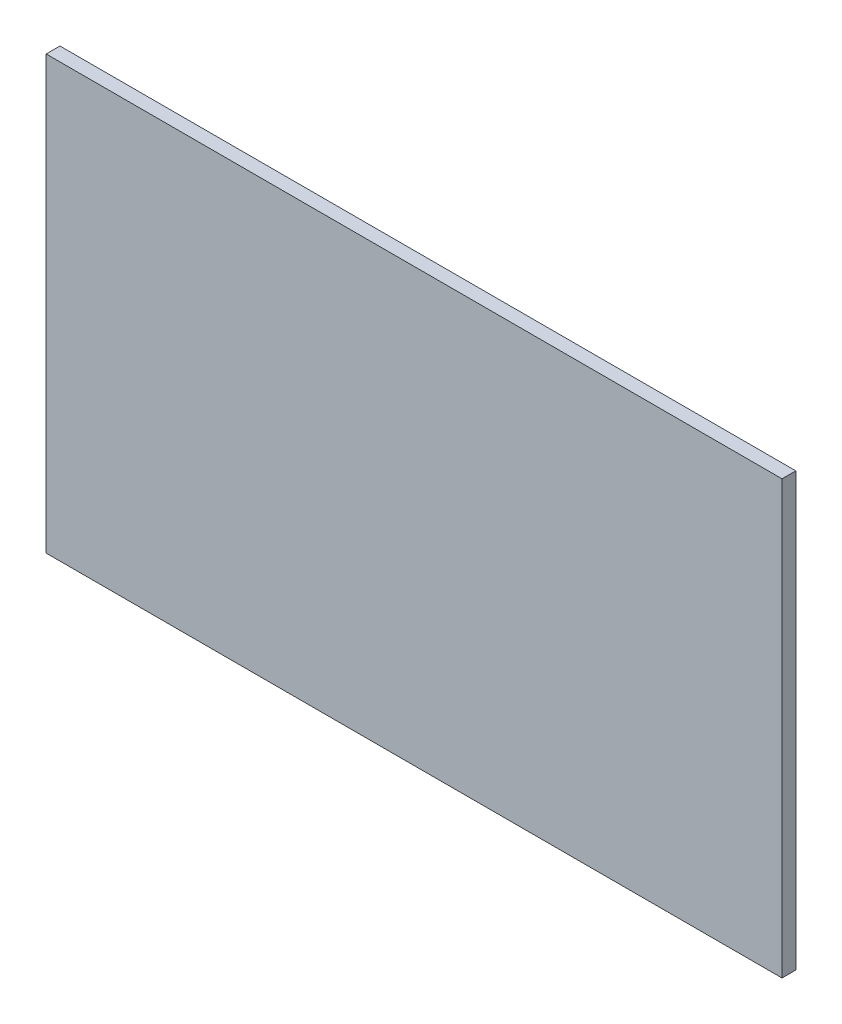
ISO-10303-21;
HEADER;
FILE_DESCRIPTION(('STEP AP214'),'2;1');
FILE_NAME('part.step','',(''),(''),'','','');
FILE_SCHEMA(('AUTOMOTIVE_DESIGN { 1 0 10303 214 1 1 1 1 }'));
ENDSEC;
DATA;
#1=APPLICATION_CONTEXT('core data for automotive mechanical design processes');
#2=APPLICATION_PROTOCOL_DEFINITION('international standard','automotive_design',2000,#1);
#3=PRODUCT_CONTEXT('',#1,'mechanical');
#4=PRODUCT('Part','Part','',(#3));
#5=PRODUCT_RELATED_PRODUCT_CATEGORY('part','',(#4));
#6=PRODUCT_DEFINITION_FORMATION('','',#4);
#7=PRODUCT_DEFINITION_CONTEXT('part definition',#1,'design');
#8=PRODUCT_DEFINITION('design','',#6,#7);
#9=PRODUCT_DEFINITION_SHAPE('','',#8);
#10=(LENGTH_UNIT() NAMED_UNIT(*) SI_UNIT(.MILLI.,.METRE.));
#11=(NAMED_UNIT(*) PLANE_ANGLE_UNIT() SI_UNIT($,.RADIAN.));
#12=(NAMED_UNIT(*) SI_UNIT($,.STERADIAN.) SOLID_ANGLE_UNIT());
#13=UNCERTAINTY_MEASURE_WITH_UNIT(LENGTH_MEASURE(1.E-05),#10,'distance_accuracy_value','');
#14=(GEOMETRIC_REPRESENTATION_CONTEXT(3) GLOBAL_UNCERTAINTY_ASSIGNED_CONTEXT((#13)) GLOBAL_UNIT_ASSIGNED_CONTEXT((#10,
#11,#12)) REPRESENTATION_CONTEXT('',''));
#15=CARTESIAN_POINT('',(0.,0.,0.));
#16=DIRECTION('',(0.,0.,1.));
#17=DIRECTION('',(1.,0.,0.));
#18=AXIS2_PLACEMENT_3D('',#15,#16,#17);
#19=CARTESIAN_POINT('',(-80.,0.,1.5));
#20=DIRECTION('',(1.,0.,0.));
#21=DIRECTION('',(0.,1.,0.));
#22=AXIS2_PLACEMENT_3D('',#19,#20,#21);
#23=PLANE('',#22);
#24=DIRECTION('',(0.,-1.,0.));
#25=VECTOR('',#24,1.);
#26=CARTESIAN_POINT('',(-80.,0.,-1.5));
#27=LINE('',#26,#25);
#28=CARTESIAN_POINT('',(-80.,0.,-1.5));
#29=VERTEX_POINT('',#28);
#30=CARTESIAN_POINT('',(-80.,-94.,-1.5));
#31=VERTEX_POINT('',#30);
#32=EDGE_CURVE('E100',#29,#31,#27,.T.);
#33=ORIENTED_EDGE('',*,*,#32,.T.);
#34=DIRECTION('',(0.,0.,-1.));
#35=VECTOR('',#34,1.);
#36=CARTESIAN_POINT('',(-80.,-94.,1.5));
#37=LINE('',#36,#35);
#38=CARTESIAN_POINT('',(-80.,-94.,1.5));
#39=VERTEX_POINT('',#38);
#40=EDGE_CURVE('E11',#39,#31,#37,.T.);
#41=ORIENTED_EDGE('',*,*,#40,.F.);
#42=DIRECTION('',(0.,-1.,0.));
#43=VECTOR('',#42,1.);
#44=CARTESIAN_POINT('',(-80.,0.,1.5));
#45=LINE('',#44,#43);
#46=CARTESIAN_POINT('',(-80.,0.,1.5));
#47=VERTEX_POINT('',#46);
#48=EDGE_CURVE('E88',#47,#39,#45,.T.);
#49=ORIENTED_EDGE('',*,*,#48,.F.);
#50=DIRECTION('',(0.,0.,-1.));
#51=VECTOR('',#50,1.);
#52=CARTESIAN_POINT('',(-80.,0.,1.5));
#53=LINE('',#52,#51);
#54=EDGE_CURVE('E96',#47,#29,#53,.T.);
#55=ORIENTED_EDGE('',*,*,#54,.T.);
#56=EDGE_LOOP('',(#33,#41,#49,#55));
#57=FACE_BOUND('',#56,.T.);
#58=ADVANCED_FACE('F37',(#57),#23,.F.);
#59=CARTESIAN_POINT('',(-80.,-94.,1.5));
#60=DIRECTION('',(0.,1.,0.));
#61=DIRECTION('',(-1.,0.,0.));
#62=AXIS2_PLACEMENT_3D('',#59,#60,#61);
#63=PLANE('',#62);
#64=DIRECTION('',(1.,0.,0.));
#65=VECTOR('',#64,1.);
#66=CARTESIAN_POINT('',(-80.,-94.,-1.5));
#67=LINE('',#66,#65);
#68=CARTESIAN_POINT('',(80.,-94.,-1.5));
#69=VERTEX_POINT('',#68);
#70=EDGE_CURVE('E92',#31,#69,#67,.T.);
#71=ORIENTED_EDGE('',*,*,#70,.T.);
#72=DIRECTION('',(0.,0.,-1.));
#73=VECTOR('',#72,1.);
#74=CARTESIAN_POINT('',(80.,-94.,1.5));
#75=LINE('',#74,#73);
#76=CARTESIAN_POINT('',(80.,-94.,1.5));
#77=VERTEX_POINT('',#76);
#78=EDGE_CURVE('E45',#77,#69,#75,.T.);
#79=ORIENTED_EDGE('',*,*,#78,.F.);
#80=DIRECTION('',(1.,0.,0.));
#81=VECTOR('',#80,1.);
#82=CARTESIAN_POINT('',(-80.,-94.,1.5));
#83=LINE('',#82,#81);
#84=EDGE_CURVE('E83',#39,#77,#83,.T.);
#85=ORIENTED_EDGE('',*,*,#84,.F.);
#86=ORIENTED_EDGE('',*,*,#40,.T.);
#87=EDGE_LOOP('',(#71,#79,#85,#86));
#88=FACE_BOUND('',#87,.T.);
#89=ADVANCED_FACE('F91',(#88),#63,.F.);
#90=CARTESIAN_POINT('',(80.,0.,1.5));
#91=DIRECTION('',(-1.,0.,0.));
#92=DIRECTION('',(0.,-1.,0.));
#93=AXIS2_PLACEMENT_3D('',#90,#91,#92);
#94=PLANE('',#93);
#95=DIRECTION('',(0.,1.,0.));
#96=VECTOR('',#95,1.);
#97=CARTESIAN_POINT('',(80.,0.,-1.5));
#98=LINE('',#97,#96);
#99=CARTESIAN_POINT('',(80.,0.,-1.5));
#100=VERTEX_POINT('',#99);
#101=EDGE_CURVE('E70',#69,#100,#98,.T.);
#102=ORIENTED_EDGE('',*,*,#101,.T.);
#103=DIRECTION('',(0.,0.,-1.));
#104=VECTOR('',#103,1.);
#105=CARTESIAN_POINT('',(80.,0.,1.5));
#106=LINE('',#105,#104);
#107=CARTESIAN_POINT('',(80.,0.,1.5));
#108=VERTEX_POINT('',#107);
#109=EDGE_CURVE('E93',#108,#100,#106,.T.);
#110=ORIENTED_EDGE('',*,*,#109,.F.);
#111=DIRECTION('',(0.,1.,0.));
#112=VECTOR('',#111,1.);
#113=CARTESIAN_POINT('',(80.,0.,1.5));
#114=LINE('',#113,#112);
#115=EDGE_CURVE('E86',#77,#108,#114,.T.);
#116=ORIENTED_EDGE('',*,*,#115,.F.);
#117=ORIENTED_EDGE('',*,*,#78,.T.);
#118=EDGE_LOOP('',(#102,#110,#116,#117));
#119=FACE_BOUND('',#118,.T.);
#120=ADVANCED_FACE('F94',(#119),#94,.F.);
#121=CARTESIAN_POINT('',(-80.,0.,1.5));
#122=DIRECTION('',(0.,-1.,0.));
#123=DIRECTION('',(1.,0.,0.));
#124=AXIS2_PLACEMENT_3D('',#121,#122,#123);
#125=PLANE('',#124);
#126=DIRECTION('',(-1.,0.,0.));
#127=VECTOR('',#126,1.);
#128=CARTESIAN_POINT('',(-80.,0.,-1.5));
#129=LINE('',#128,#127);
#130=EDGE_CURVE('E76',#100,#29,#129,.T.);
#131=ORIENTED_EDGE('',*,*,#130,.T.);
#132=ORIENTED_EDGE('',*,*,#54,.F.);
#133=DIRECTION('',(-1.,0.,0.));
#134=VECTOR('',#133,1.);
#135=CARTESIAN_POINT('',(-80.,0.,1.5));
#136=LINE('',#135,#134);
#137=EDGE_CURVE('E53',#108,#47,#136,.T.);
#138=ORIENTED_EDGE('',*,*,#137,.F.);
#139=ORIENTED_EDGE('',*,*,#109,.T.);
#140=EDGE_LOOP('',(#131,#132,#138,#139));
#141=FACE_BOUND('',#140,.T.);
#142=ADVANCED_FACE('F107',(#141),#125,.F.);
#143=CARTESIAN_POINT('',(0.,0.,1.5));
#144=DIRECTION('',(0.,0.,1.));
#145=DIRECTION('',(1.,0.,0.));
#146=AXIS2_PLACEMENT_3D('',#143,#144,#145);
#147=PLANE('',#146);
#148=ORIENTED_EDGE('',*,*,#48,.T.);
#149=ORIENTED_EDGE('',*,*,#84,.T.);
#150=ORIENTED_EDGE('',*,*,#115,.T.);
#151=ORIENTED_EDGE('',*,*,#137,.T.);
#152=EDGE_LOOP('',(#148,#149,#150,#151));
#153=FACE_BOUND('',#152,.T.);
#154=ADVANCED_FACE('F84',(#153),#147,.T.);
#155=CARTESIAN_POINT('',(0.,0.,-1.5));
#156=DIRECTION('',(0.,0.,1.));
#157=DIRECTION('',(1.,0.,0.));
#158=AXIS2_PLACEMENT_3D('',#155,#156,#157);
#159=PLANE('',#158);
#160=ORIENTED_EDGE('',*,*,#32,.F.);
#161=ORIENTED_EDGE('',*,*,#130,.F.);
#162=ORIENTED_EDGE('',*,*,#101,.F.);
#163=ORIENTED_EDGE('',*,*,#70,.F.);
#164=EDGE_LOOP('',(#160,#161,#162,#163));
#165=FACE_BOUND('',#164,.T.);
#166=ADVANCED_FACE('F110',(#165),#159,.F.);
#167=CLOSED_SHELL('',(#58,#89,#120,#142,#154,#166));
#168=MANIFOLD_SOLID_BREP('B2',#167);
#169=ADVANCED_BREP_SHAPE_REPRESENTATION('',(#18,#168),#14);
#170=SHAPE_DEFINITION_REPRESENTATION(#9,#169);
ENDSEC;
END-ISO-10303-21;
